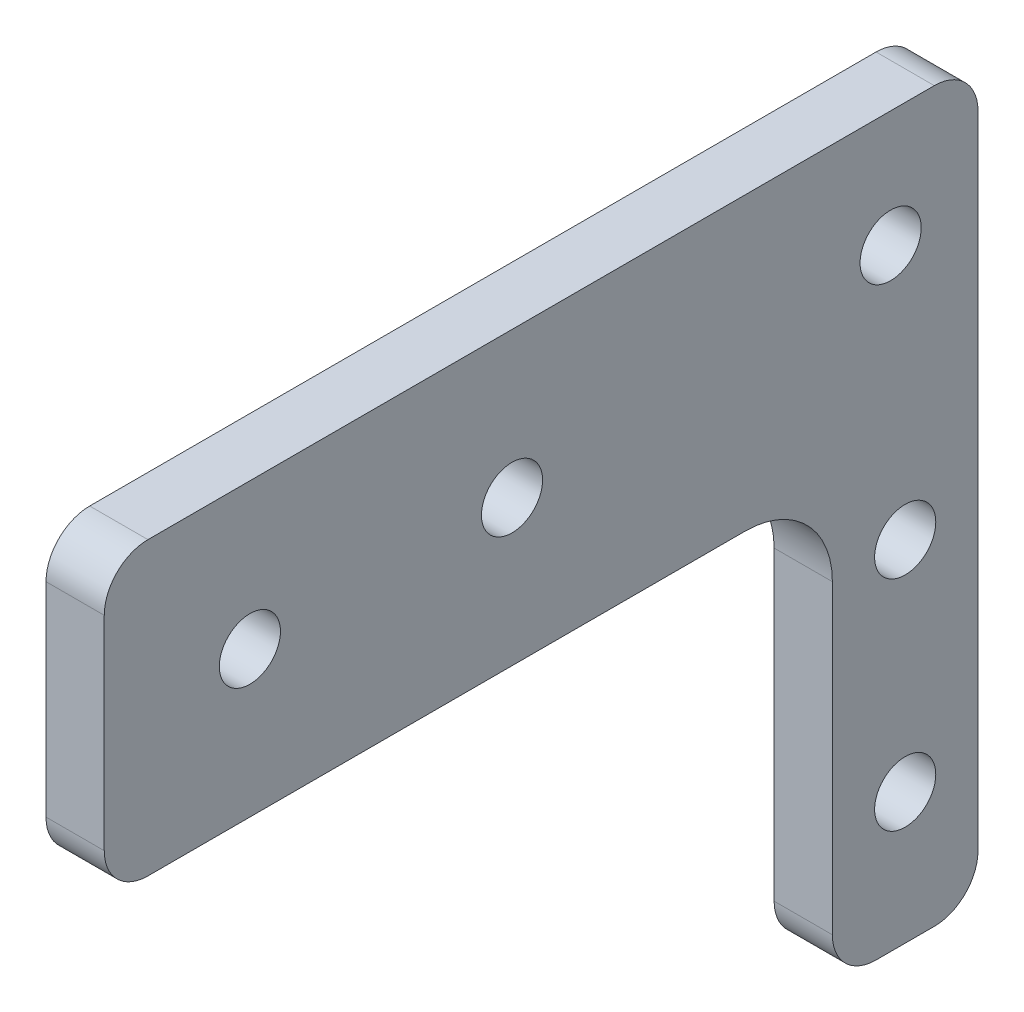
ISO-10303-21;
HEADER;
FILE_DESCRIPTION(('STEP AP214'),'2;1');
FILE_NAME('part.step','',(''),(''),'','','');
FILE_SCHEMA(('AUTOMOTIVE_DESIGN { 1 0 10303 214 1 1 1 1 }'));
ENDSEC;
DATA;
#1=APPLICATION_CONTEXT('core data for automotive mechanical design processes');
#2=APPLICATION_PROTOCOL_DEFINITION('international standard','automotive_design',2000,#1);
#3=PRODUCT_CONTEXT('',#1,'mechanical');
#4=PRODUCT('Part','Part','',(#3));
#5=PRODUCT_RELATED_PRODUCT_CATEGORY('part','',(#4));
#6=PRODUCT_DEFINITION_FORMATION('','',#4);
#7=PRODUCT_DEFINITION_CONTEXT('part definition',#1,'design');
#8=PRODUCT_DEFINITION('design','',#6,#7);
#9=PRODUCT_DEFINITION_SHAPE('','',#8);
#10=(LENGTH_UNIT() NAMED_UNIT(*) SI_UNIT(.MILLI.,.METRE.));
#11=(NAMED_UNIT(*) PLANE_ANGLE_UNIT() SI_UNIT($,.RADIAN.));
#12=(NAMED_UNIT(*) SI_UNIT($,.STERADIAN.) SOLID_ANGLE_UNIT());
#13=UNCERTAINTY_MEASURE_WITH_UNIT(LENGTH_MEASURE(1.E-05),#10,'distance_accuracy_value','');
#14=(GEOMETRIC_REPRESENTATION_CONTEXT(3) GLOBAL_UNCERTAINTY_ASSIGNED_CONTEXT((#13)) GLOBAL_UNIT_ASSIGNED_CONTEXT((#10,
#11,#12)) REPRESENTATION_CONTEXT('',''));
#15=CARTESIAN_POINT('',(0.,0.,0.));
#16=DIRECTION('',(0.,0.,1.));
#17=DIRECTION('',(1.,0.,0.));
#18=AXIS2_PLACEMENT_3D('',#15,#16,#17);
#19=CARTESIAN_POINT('',(4.,54.0416666666667,170.25));
#20=DIRECTION('',(-1.,0.,0.));
#21=DIRECTION('',(0.,0.,1.));
#22=AXIS2_PLACEMENT_3D('',#19,#20,#21);
#23=CYLINDRICAL_SURFACE('',#22,6.00000000000002);
#24=CARTESIAN_POINT('',(0.,54.0416666666667,170.25));
#25=DIRECTION('',(-1.,0.,0.));
#26=DIRECTION('',(0.,0.,-1.));
#27=AXIS2_PLACEMENT_3D('',#24,#25,#26);
#28=CIRCLE('',#27,6.00000000000002);
#29=CARTESIAN_POINT('',(0.,60.0416666666667,170.25));
#30=VERTEX_POINT('',#29);
#31=CARTESIAN_POINT('',(0.,54.0416666666667,164.25));
#32=VERTEX_POINT('',#31);
#33=EDGE_CURVE('E156',#30,#32,#28,.T.);
#34=ORIENTED_EDGE('',*,*,#33,.T.);
#35=DIRECTION('',(-1.,0.,0.));
#36=VECTOR('',#35,1.);
#37=CARTESIAN_POINT('',(4.,54.0416666666667,164.25));
#38=LINE('',#37,#36);
#39=CARTESIAN_POINT('',(4.,54.0416666666667,164.25));
#40=VERTEX_POINT('',#39);
#41=EDGE_CURVE('E11',#40,#32,#38,.T.);
#42=ORIENTED_EDGE('',*,*,#41,.F.);
#43=CARTESIAN_POINT('',(4.,54.0416666666667,170.25));
#44=DIRECTION('',(-1.,0.,0.));
#45=DIRECTION('',(0.,0.,-1.));
#46=AXIS2_PLACEMENT_3D('',#43,#44,#45);
#47=CIRCLE('',#46,6.00000000000002);
#48=CARTESIAN_POINT('',(4.,60.0416666666667,170.25));
#49=VERTEX_POINT('',#48);
#50=EDGE_CURVE('E178',#49,#40,#47,.T.);
#51=ORIENTED_EDGE('',*,*,#50,.F.);
#52=DIRECTION('',(-1.,0.,0.));
#53=VECTOR('',#52,1.);
#54=CARTESIAN_POINT('',(4.,60.0416666666667,170.25));
#55=LINE('',#54,#53);
#56=EDGE_CURVE('E152',#49,#30,#55,.T.);
#57=ORIENTED_EDGE('',*,*,#56,.T.);
#58=EDGE_LOOP('',(#34,#42,#51,#57));
#59=FACE_BOUND('',#58,.T.);
#60=ADVANCED_FACE('F34',(#59),#23,.F.);
#61=CARTESIAN_POINT('',(4.,33.0416666666667,164.25));
#62=DIRECTION('',(0.,0.,-1.));
#63=DIRECTION('',(0.,1.,0.));
#64=AXIS2_PLACEMENT_3D('',#61,#62,#63);
#65=PLANE('',#64);
#66=DIRECTION('',(0.,-1.,0.));
#67=VECTOR('',#66,1.);
#68=CARTESIAN_POINT('',(0.,33.0416666666667,164.25));
#69=LINE('',#68,#67);
#70=CARTESIAN_POINT('',(0.,33.0416666666667,164.25));
#71=VERTEX_POINT('',#70);
#72=EDGE_CURVE('E159',#32,#71,#69,.T.);
#73=ORIENTED_EDGE('',*,*,#72,.T.);
#74=DIRECTION('',(-1.,0.,0.));
#75=VECTOR('',#74,1.);
#76=CARTESIAN_POINT('',(4.,33.0416666666667,164.25));
#77=LINE('',#76,#75);
#78=CARTESIAN_POINT('',(4.,33.0416666666667,164.25));
#79=VERTEX_POINT('',#78);
#80=EDGE_CURVE('E43',#79,#71,#77,.T.);
#81=ORIENTED_EDGE('',*,*,#80,.F.);
#82=DIRECTION('',(0.,-1.,0.));
#83=VECTOR('',#82,1.);
#84=CARTESIAN_POINT('',(4.,33.0416666666667,164.25));
#85=LINE('',#84,#83);
#86=EDGE_CURVE('E107',#40,#79,#85,.T.);
#87=ORIENTED_EDGE('',*,*,#86,.F.);
#88=ORIENTED_EDGE('',*,*,#41,.T.);
#89=EDGE_LOOP('',(#73,#81,#87,#88));
#90=FACE_BOUND('',#89,.T.);
#91=ADVANCED_FACE('F234',(#90),#65,.F.);
#92=CARTESIAN_POINT('',(4.,33.0416666666667,161.25));
#93=DIRECTION('',(-1.,0.,0.));
#94=DIRECTION('',(0.,0.,1.));
#95=AXIS2_PLACEMENT_3D('',#92,#93,#94);
#96=CYLINDRICAL_SURFACE('',#95,3.);
#97=CARTESIAN_POINT('',(0.,33.0416666666667,161.25));
#98=DIRECTION('',(1.,0.,0.));
#99=DIRECTION('',(0.,0.,1.));
#100=AXIS2_PLACEMENT_3D('',#97,#98,#99);
#101=CIRCLE('',#100,3.);
#102=CARTESIAN_POINT('',(0.,30.0416666666667,161.25));
#103=VERTEX_POINT('',#102);
#104=EDGE_CURVE('E161',#71,#103,#101,.T.);
#105=ORIENTED_EDGE('',*,*,#104,.T.);
#106=DIRECTION('',(-1.,0.,0.));
#107=VECTOR('',#106,1.);
#108=CARTESIAN_POINT('',(4.,30.0416666666667,161.25));
#109=LINE('',#108,#107);
#110=CARTESIAN_POINT('',(4.,30.0416666666667,161.25));
#111=VERTEX_POINT('',#110);
#112=EDGE_CURVE('E197',#111,#103,#109,.T.);
#113=ORIENTED_EDGE('',*,*,#112,.F.);
#114=CARTESIAN_POINT('',(4.,33.0416666666667,161.25));
#115=DIRECTION('',(1.,0.,0.));
#116=DIRECTION('',(0.,0.,1.));
#117=AXIS2_PLACEMENT_3D('',#114,#115,#116);
#118=CIRCLE('',#117,3.);
#119=EDGE_CURVE('E249',#79,#111,#118,.T.);
#120=ORIENTED_EDGE('',*,*,#119,.F.);
#121=ORIENTED_EDGE('',*,*,#80,.T.);
#122=EDGE_LOOP('',(#105,#113,#120,#121));
#123=FACE_BOUND('',#122,.T.);
#124=ADVANCED_FACE('F239',(#123),#96,.T.);
#125=CARTESIAN_POINT('',(4.,30.0416666666667,157.25));
#126=DIRECTION('',(0.,1.,0.));
#127=DIRECTION('',(0.,0.,1.));
#128=AXIS2_PLACEMENT_3D('',#125,#126,#127);
#129=PLANE('',#128);
#130=DIRECTION('',(0.,0.,-1.));
#131=VECTOR('',#130,1.);
#132=CARTESIAN_POINT('',(0.,30.0416666666667,157.25));
#133=LINE('',#132,#131);
#134=CARTESIAN_POINT('',(0.,30.0416666666667,157.25));
#135=VERTEX_POINT('',#134);
#136=EDGE_CURVE('E163',#103,#135,#133,.T.);
#137=ORIENTED_EDGE('',*,*,#136,.T.);
#138=DIRECTION('',(-1.,0.,0.));
#139=VECTOR('',#138,1.);
#140=CARTESIAN_POINT('',(4.,30.0416666666667,157.25));
#141=LINE('',#140,#139);
#142=CARTESIAN_POINT('',(4.,30.0416666666667,157.25));
#143=VERTEX_POINT('',#142);
#144=EDGE_CURVE('E194',#143,#135,#141,.T.);
#145=ORIENTED_EDGE('',*,*,#144,.F.);
#146=DIRECTION('',(0.,0.,-1.));
#147=VECTOR('',#146,1.);
#148=CARTESIAN_POINT('',(4.,30.0416666666667,157.25));
#149=LINE('',#148,#147);
#150=EDGE_CURVE('E251',#111,#143,#149,.T.);
#151=ORIENTED_EDGE('',*,*,#150,.F.);
#152=ORIENTED_EDGE('',*,*,#112,.T.);
#153=EDGE_LOOP('',(#137,#145,#151,#152));
#154=FACE_BOUND('',#153,.T.);
#155=ADVANCED_FACE('F289',(#154),#129,.F.);
#156=CARTESIAN_POINT('',(4.,33.0416666666667,157.25));
#157=DIRECTION('',(-1.,0.,0.));
#158=DIRECTION('',(0.,0.,1.));
#159=AXIS2_PLACEMENT_3D('',#156,#157,#158);
#160=CYLINDRICAL_SURFACE('',#159,3.00000000000002);
#161=CARTESIAN_POINT('',(0.,33.0416666666667,157.25));
#162=DIRECTION('',(1.,0.,0.));
#163=DIRECTION('',(0.,0.,-1.));
#164=AXIS2_PLACEMENT_3D('',#161,#162,#163);
#165=CIRCLE('',#164,3.00000000000002);
#166=CARTESIAN_POINT('',(0.,33.0416666666667,154.25));
#167=VERTEX_POINT('',#166);
#168=EDGE_CURVE('E165',#135,#167,#165,.T.);
#169=ORIENTED_EDGE('',*,*,#168,.T.);
#170=DIRECTION('',(-1.,0.,0.));
#171=VECTOR('',#170,1.);
#172=CARTESIAN_POINT('',(4.,33.0416666666667,154.25));
#173=LINE('',#172,#171);
#174=CARTESIAN_POINT('',(4.,33.0416666666667,154.25));
#175=VERTEX_POINT('',#174);
#176=EDGE_CURVE('E191',#175,#167,#173,.T.);
#177=ORIENTED_EDGE('',*,*,#176,.F.);
#178=CARTESIAN_POINT('',(4.,33.0416666666667,157.25));
#179=DIRECTION('',(1.,0.,0.));
#180=DIRECTION('',(0.,0.,-1.));
#181=AXIS2_PLACEMENT_3D('',#178,#179,#180);
#182=CIRCLE('',#181,3.00000000000002);
#183=EDGE_CURVE('E253',#143,#175,#182,.T.);
#184=ORIENTED_EDGE('',*,*,#183,.F.);
#185=ORIENTED_EDGE('',*,*,#144,.T.);
#186=EDGE_LOOP('',(#169,#177,#184,#185));
#187=FACE_BOUND('',#186,.T.);
#188=ADVANCED_FACE('F286',(#187),#160,.T.);
#189=CARTESIAN_POINT('',(4.,77.0416666666667,154.25));
#190=DIRECTION('',(0.,0.,1.));
#191=DIRECTION('',(0.,-1.,0.));
#192=AXIS2_PLACEMENT_3D('',#189,#190,#191);
#193=PLANE('',#192);
#194=DIRECTION('',(0.,1.,0.));
#195=VECTOR('',#194,1.);
#196=CARTESIAN_POINT('',(0.,77.0416666666667,154.25));
#197=LINE('',#196,#195);
#198=CARTESIAN_POINT('',(0.,77.0416666666667,154.25));
#199=VERTEX_POINT('',#198);
#200=EDGE_CURVE('E167',#167,#199,#197,.T.);
#201=ORIENTED_EDGE('',*,*,#200,.T.);
#202=DIRECTION('',(-1.,0.,0.));
#203=VECTOR('',#202,1.);
#204=CARTESIAN_POINT('',(4.,77.0416666666667,154.25));
#205=LINE('',#204,#203);
#206=CARTESIAN_POINT('',(4.,77.0416666666667,154.25));
#207=VERTEX_POINT('',#206);
#208=EDGE_CURVE('E188',#207,#199,#205,.T.);
#209=ORIENTED_EDGE('',*,*,#208,.F.);
#210=DIRECTION('',(0.,1.,0.));
#211=VECTOR('',#210,1.);
#212=CARTESIAN_POINT('',(4.,77.0416666666667,154.25));
#213=LINE('',#212,#211);
#214=EDGE_CURVE('E259',#175,#207,#213,.T.);
#215=ORIENTED_EDGE('',*,*,#214,.F.);
#216=ORIENTED_EDGE('',*,*,#176,.T.);
#217=EDGE_LOOP('',(#201,#209,#215,#216));
#218=FACE_BOUND('',#217,.T.);
#219=ADVANCED_FACE('F282',(#218),#193,.F.);
#220=CARTESIAN_POINT('',(4.,77.0416666666667,157.25));
#221=DIRECTION('',(-1.,0.,0.));
#222=DIRECTION('',(0.,0.,1.));
#223=AXIS2_PLACEMENT_3D('',#220,#221,#222);
#224=CYLINDRICAL_SURFACE('',#223,3.);
#225=CARTESIAN_POINT('',(0.,77.0416666666667,157.25));
#226=DIRECTION('',(1.,0.,0.));
#227=DIRECTION('',(0.,0.,1.));
#228=AXIS2_PLACEMENT_3D('',#225,#226,#227);
#229=CIRCLE('',#228,3.);
#230=CARTESIAN_POINT('',(0.,80.0416666666667,157.25));
#231=VERTEX_POINT('',#230);
#232=EDGE_CURVE('E169',#199,#231,#229,.T.);
#233=ORIENTED_EDGE('',*,*,#232,.T.);
#234=DIRECTION('',(-1.,0.,0.));
#235=VECTOR('',#234,1.);
#236=CARTESIAN_POINT('',(4.,80.0416666666667,157.25));
#237=LINE('',#236,#235);
#238=CARTESIAN_POINT('',(4.,80.0416666666667,157.25));
#239=VERTEX_POINT('',#238);
#240=EDGE_CURVE('E185',#239,#231,#237,.T.);
#241=ORIENTED_EDGE('',*,*,#240,.F.);
#242=CARTESIAN_POINT('',(4.,77.0416666666667,157.25));
#243=DIRECTION('',(1.,0.,0.));
#244=DIRECTION('',(0.,0.,1.));
#245=AXIS2_PLACEMENT_3D('',#242,#243,#244);
#246=CIRCLE('',#245,3.);
#247=EDGE_CURVE('E261',#207,#239,#246,.T.);
#248=ORIENTED_EDGE('',*,*,#247,.F.);
#249=ORIENTED_EDGE('',*,*,#208,.T.);
#250=EDGE_LOOP('',(#233,#241,#248,#249));
#251=FACE_BOUND('',#250,.T.);
#252=ADVANCED_FACE('F278',(#251),#224,.T.);
#253=CARTESIAN_POINT('',(4.,80.0416666666667,211.25));
#254=DIRECTION('',(0.,-1.,0.));
#255=DIRECTION('',(0.,0.,-1.));
#256=AXIS2_PLACEMENT_3D('',#253,#254,#255);
#257=PLANE('',#256);
#258=DIRECTION('',(0.,0.,1.));
#259=VECTOR('',#258,1.);
#260=CARTESIAN_POINT('',(0.,80.0416666666667,211.25));
#261=LINE('',#260,#259);
#262=CARTESIAN_POINT('',(0.,80.0416666666667,211.25));
#263=VERTEX_POINT('',#262);
#264=EDGE_CURVE('E171',#231,#263,#261,.T.);
#265=ORIENTED_EDGE('',*,*,#264,.T.);
#266=DIRECTION('',(-1.,0.,0.));
#267=VECTOR('',#266,1.);
#268=CARTESIAN_POINT('',(4.,80.0416666666667,211.25));
#269=LINE('',#268,#267);
#270=CARTESIAN_POINT('',(4.,80.0416666666667,211.25));
#271=VERTEX_POINT('',#270);
#272=EDGE_CURVE('E182',#271,#263,#269,.T.);
#273=ORIENTED_EDGE('',*,*,#272,.F.);
#274=DIRECTION('',(0.,0.,1.));
#275=VECTOR('',#274,1.);
#276=CARTESIAN_POINT('',(4.,80.0416666666667,211.25));
#277=LINE('',#276,#275);
#278=EDGE_CURVE('E263',#239,#271,#277,.T.);
#279=ORIENTED_EDGE('',*,*,#278,.F.);
#280=ORIENTED_EDGE('',*,*,#240,.T.);
#281=EDGE_LOOP('',(#265,#273,#279,#280));
#282=FACE_BOUND('',#281,.T.);
#283=ADVANCED_FACE('F269',(#282),#257,.F.);
#284=CARTESIAN_POINT('',(4.,77.0416666666667,211.25));
#285=DIRECTION('',(-1.,0.,0.));
#286=DIRECTION('',(0.,0.,1.));
#287=AXIS2_PLACEMENT_3D('',#284,#285,#286);
#288=CYLINDRICAL_SURFACE('',#287,3.);
#289=CARTESIAN_POINT('',(0.,77.0416666666667,211.25));
#290=DIRECTION('',(1.,0.,0.));
#291=DIRECTION('',(0.,0.,1.));
#292=AXIS2_PLACEMENT_3D('',#289,#290,#291);
#293=CIRCLE('',#292,3.);
#294=CARTESIAN_POINT('',(0.,77.0416666666667,214.25));
#295=VERTEX_POINT('',#294);
#296=EDGE_CURVE('E173',#263,#295,#293,.T.);
#297=ORIENTED_EDGE('',*,*,#296,.T.);
#298=DIRECTION('',(-1.,0.,0.));
#299=VECTOR('',#298,1.);
#300=CARTESIAN_POINT('',(4.,77.0416666666667,214.25));
#301=LINE('',#300,#299);
#302=CARTESIAN_POINT('',(4.,77.0416666666667,214.25));
#303=VERTEX_POINT('',#302);
#304=EDGE_CURVE('E147',#303,#295,#301,.T.);
#305=ORIENTED_EDGE('',*,*,#304,.F.);
#306=CARTESIAN_POINT('',(4.,77.0416666666667,211.25));
#307=DIRECTION('',(1.,0.,0.));
#308=DIRECTION('',(0.,0.,1.));
#309=AXIS2_PLACEMENT_3D('',#306,#307,#308);
#310=CIRCLE('',#309,3.);
#311=EDGE_CURVE('E138',#271,#303,#310,.T.);
#312=ORIENTED_EDGE('',*,*,#311,.F.);
#313=ORIENTED_EDGE('',*,*,#272,.T.);
#314=EDGE_LOOP('',(#297,#305,#312,#313));
#315=FACE_BOUND('',#314,.T.);
#316=ADVANCED_FACE('F273',(#315),#288,.T.);
#317=CARTESIAN_POINT('',(4.,63.0416666666667,214.25));
#318=DIRECTION('',(0.,0.,-1.));
#319=DIRECTION('',(-1.,0.,0.));
#320=AXIS2_PLACEMENT_3D('',#317,#318,#319);
#321=PLANE('',#320);
#322=DIRECTION('',(0.,-1.,0.));
#323=VECTOR('',#322,1.);
#324=CARTESIAN_POINT('',(0.,63.0416666666667,214.25));
#325=LINE('',#324,#323);
#326=CARTESIAN_POINT('',(0.,63.0416666666667,214.25));
#327=VERTEX_POINT('',#326);
#328=EDGE_CURVE('E146',#295,#327,#325,.T.);
#329=ORIENTED_EDGE('',*,*,#328,.T.);
#330=DIRECTION('',(-1.,0.,0.));
#331=VECTOR('',#330,1.);
#332=CARTESIAN_POINT('',(4.,63.0416666666667,214.25));
#333=LINE('',#332,#331);
#334=CARTESIAN_POINT('',(4.,63.0416666666667,214.25));
#335=VERTEX_POINT('',#334);
#336=EDGE_CURVE('E143',#335,#327,#333,.T.);
#337=ORIENTED_EDGE('',*,*,#336,.F.);
#338=DIRECTION('',(0.,-1.,0.));
#339=VECTOR('',#338,1.);
#340=CARTESIAN_POINT('',(4.,63.0416666666667,214.25));
#341=LINE('',#340,#339);
#342=EDGE_CURVE('E132',#303,#335,#341,.T.);
#343=ORIENTED_EDGE('',*,*,#342,.F.);
#344=ORIENTED_EDGE('',*,*,#304,.T.);
#345=EDGE_LOOP('',(#329,#337,#343,#344));
#346=FACE_BOUND('',#345,.T.);
#347=ADVANCED_FACE('F144',(#346),#321,.F.);
#348=CARTESIAN_POINT('',(4.,63.0416666666667,211.25));
#349=DIRECTION('',(-1.,0.,0.));
#350=DIRECTION('',(0.,0.,1.));
#351=AXIS2_PLACEMENT_3D('',#348,#349,#350);
#352=CYLINDRICAL_SURFACE('',#351,3.);
#353=CARTESIAN_POINT('',(0.,63.0416666666667,211.25));
#354=DIRECTION('',(1.,0.,0.));
#355=DIRECTION('',(0.,0.,-1.));
#356=AXIS2_PLACEMENT_3D('',#353,#354,#355);
#357=CIRCLE('',#356,3.);
#358=CARTESIAN_POINT('',(0.,60.0416666666667,211.25));
#359=VERTEX_POINT('',#358);
#360=EDGE_CURVE('E93',#327,#359,#357,.T.);
#361=ORIENTED_EDGE('',*,*,#360,.T.);
#362=DIRECTION('',(-1.,0.,0.));
#363=VECTOR('',#362,1.);
#364=CARTESIAN_POINT('',(4.,60.0416666666667,211.25));
#365=LINE('',#364,#363);
#366=CARTESIAN_POINT('',(4.,60.0416666666667,211.25));
#367=VERTEX_POINT('',#366);
#368=EDGE_CURVE('E148',#367,#359,#365,.T.);
#369=ORIENTED_EDGE('',*,*,#368,.F.);
#370=CARTESIAN_POINT('',(4.,63.0416666666667,211.25));
#371=DIRECTION('',(1.,0.,0.));
#372=DIRECTION('',(0.,0.,-1.));
#373=AXIS2_PLACEMENT_3D('',#370,#371,#372);
#374=CIRCLE('',#373,3.);
#375=EDGE_CURVE('E136',#335,#367,#374,.T.);
#376=ORIENTED_EDGE('',*,*,#375,.F.);
#377=ORIENTED_EDGE('',*,*,#336,.T.);
#378=EDGE_LOOP('',(#361,#369,#376,#377));
#379=FACE_BOUND('',#378,.T.);
#380=ADVANCED_FACE('F150',(#379),#352,.T.);
#381=CARTESIAN_POINT('',(4.,60.0416666666667,170.25));
#382=DIRECTION('',(0.,1.,0.));
#383=DIRECTION('',(0.,0.,1.));
#384=AXIS2_PLACEMENT_3D('',#381,#382,#383);
#385=PLANE('',#384);
#386=DIRECTION('',(0.,0.,-1.));
#387=VECTOR('',#386,1.);
#388=CARTESIAN_POINT('',(0.,60.0416666666667,170.25));
#389=LINE('',#388,#387);
#390=EDGE_CURVE('E99',#359,#30,#389,.T.);
#391=ORIENTED_EDGE('',*,*,#390,.T.);
#392=ORIENTED_EDGE('',*,*,#56,.F.);
#393=DIRECTION('',(0.,0.,-1.));
#394=VECTOR('',#393,1.);
#395=CARTESIAN_POINT('',(4.,60.0416666666667,170.25));
#396=LINE('',#395,#394);
#397=EDGE_CURVE('E52',#367,#49,#396,.T.);
#398=ORIENTED_EDGE('',*,*,#397,.F.);
#399=ORIENTED_EDGE('',*,*,#368,.T.);
#400=EDGE_LOOP('',(#391,#392,#398,#399));
#401=FACE_BOUND('',#400,.T.);
#402=ADVANCED_FACE('F311',(#401),#385,.F.);
#403=CARTESIAN_POINT('',(4.,54.0416666666667,170.25));
#404=DIRECTION('',(1.,0.,0.));
#405=DIRECTION('',(0.,0.,-1.));
#406=AXIS2_PLACEMENT_3D('',#403,#404,#405);
#407=PLANE('',#406);
#408=CARTESIAN_POINT('',(4.,70.0416666666667,204.25));
#409=DIRECTION('',(1.,0.,0.));
#410=DIRECTION('',(0.,0.,-1.));
#411=AXIS2_PLACEMENT_3D('',#408,#409,#410);
#412=CIRCLE('',#411,2.09999999999999);
#413=CARTESIAN_POINT('',(4.,70.0416666666667,202.15));
#414=VERTEX_POINT('',#413);
#415=EDGE_CURVE('E206',#414,#414,#412,.T.);
#416=ORIENTED_EDGE('',*,*,#415,.F.);
#417=EDGE_LOOP('',(#416));
#418=FACE_BOUND('',#417,.T.);
#419=CARTESIAN_POINT('',(4.,39.0416666666667,159.25));
#420=DIRECTION('',(1.,0.,0.));
#421=DIRECTION('',(0.,0.,-1.));
#422=AXIS2_PLACEMENT_3D('',#419,#420,#421);
#423=CIRCLE('',#422,2.09999999999999);
#424=CARTESIAN_POINT('',(4.,39.0416666666667,157.15));
#425=VERTEX_POINT('',#424);
#426=EDGE_CURVE('E344',#425,#425,#423,.T.);
#427=ORIENTED_EDGE('',*,*,#426,.F.);
#428=EDGE_LOOP('',(#427));
#429=FACE_BOUND('',#428,.T.);
#430=CARTESIAN_POINT('',(4.,72.0416666666667,160.25));
#431=DIRECTION('',(1.,0.,0.));
#432=DIRECTION('',(0.,0.,-1.));
#433=AXIS2_PLACEMENT_3D('',#430,#431,#432);
#434=CIRCLE('',#433,2.09999999999999);
#435=CARTESIAN_POINT('',(4.,72.0416666666667,158.15));
#436=VERTEX_POINT('',#435);
#437=EDGE_CURVE('E333',#436,#436,#434,.T.);
#438=ORIENTED_EDGE('',*,*,#437,.F.);
#439=EDGE_LOOP('',(#438));
#440=FACE_BOUND('',#439,.T.);
#441=CARTESIAN_POINT('',(4.,54.0416666666667,159.25));
#442=DIRECTION('',(1.,0.,0.));
#443=DIRECTION('',(0.,0.,-1.));
#444=AXIS2_PLACEMENT_3D('',#441,#442,#443);
#445=CIRCLE('',#444,2.09999999999999);
#446=CARTESIAN_POINT('',(4.,54.0416666666667,157.15));
#447=VERTEX_POINT('',#446);
#448=EDGE_CURVE('E343',#447,#447,#445,.T.);
#449=ORIENTED_EDGE('',*,*,#448,.F.);
#450=EDGE_LOOP('',(#449));
#451=FACE_BOUND('',#450,.T.);
#452=CARTESIAN_POINT('',(4.,70.0416666666667,186.25));
#453=DIRECTION('',(1.,0.,0.));
#454=DIRECTION('',(0.,0.,-1.));
#455=AXIS2_PLACEMENT_3D('',#452,#453,#454);
#456=CIRCLE('',#455,2.09999999999999);
#457=CARTESIAN_POINT('',(4.,70.0416666666667,184.15));
#458=VERTEX_POINT('',#457);
#459=EDGE_CURVE('E347',#458,#458,#456,.T.);
#460=ORIENTED_EDGE('',*,*,#459,.F.);
#461=EDGE_LOOP('',(#460));
#462=FACE_BOUND('',#461,.T.);
#463=ORIENTED_EDGE('',*,*,#50,.T.);
#464=ORIENTED_EDGE('',*,*,#86,.T.);
#465=ORIENTED_EDGE('',*,*,#119,.T.);
#466=ORIENTED_EDGE('',*,*,#150,.T.);
#467=ORIENTED_EDGE('',*,*,#183,.T.);
#468=ORIENTED_EDGE('',*,*,#214,.T.);
#469=ORIENTED_EDGE('',*,*,#247,.T.);
#470=ORIENTED_EDGE('',*,*,#278,.T.);
#471=ORIENTED_EDGE('',*,*,#311,.T.);
#472=ORIENTED_EDGE('',*,*,#342,.T.);
#473=ORIENTED_EDGE('',*,*,#375,.T.);
#474=ORIENTED_EDGE('',*,*,#397,.T.);
#475=EDGE_LOOP('',(#463,#464,#465,#466,#467,#468,#469,#470,#471,#472,#473,#474));
#476=FACE_BOUND('',#475,.T.);
#477=ADVANCED_FACE('F134',(#418,#429,#440,#451,#462,#476),#407,.T.);
#478=CARTESIAN_POINT('',(0.,54.0416666666667,170.25));
#479=DIRECTION('',(1.,0.,0.));
#480=DIRECTION('',(0.,0.,-1.));
#481=AXIS2_PLACEMENT_3D('',#478,#479,#480);
#482=PLANE('',#481);
#483=CARTESIAN_POINT('',(0.,70.0416666666667,204.25));
#484=DIRECTION('',(1.,0.,0.));
#485=DIRECTION('',(0.,0.,-1.));
#486=AXIS2_PLACEMENT_3D('',#483,#484,#485);
#487=CIRCLE('',#486,2.09999999999999);
#488=CARTESIAN_POINT('',(0.,70.0416666666667,202.15));
#489=VERTEX_POINT('',#488);
#490=EDGE_CURVE('E37',#489,#489,#487,.T.);
#491=ORIENTED_EDGE('',*,*,#490,.T.);
#492=EDGE_LOOP('',(#491));
#493=FACE_BOUND('',#492,.T.);
#494=CARTESIAN_POINT('',(0.,39.0416666666667,159.25));
#495=DIRECTION('',(1.,0.,0.));
#496=DIRECTION('',(0.,0.,-1.));
#497=AXIS2_PLACEMENT_3D('',#494,#495,#496);
#498=CIRCLE('',#497,2.09999999999999);
#499=CARTESIAN_POINT('',(0.,39.0416666666667,157.15));
#500=VERTEX_POINT('',#499);
#501=EDGE_CURVE('E211',#500,#500,#498,.T.);
#502=ORIENTED_EDGE('',*,*,#501,.T.);
#503=EDGE_LOOP('',(#502));
#504=FACE_BOUND('',#503,.T.);
#505=CARTESIAN_POINT('',(0.,72.0416666666667,160.25));
#506=DIRECTION('',(1.,0.,0.));
#507=DIRECTION('',(0.,0.,-1.));
#508=AXIS2_PLACEMENT_3D('',#505,#506,#507);
#509=CIRCLE('',#508,2.09999999999999);
#510=CARTESIAN_POINT('',(0.,72.0416666666667,158.15));
#511=VERTEX_POINT('',#510);
#512=EDGE_CURVE('E209',#511,#511,#509,.T.);
#513=ORIENTED_EDGE('',*,*,#512,.T.);
#514=EDGE_LOOP('',(#513));
#515=FACE_BOUND('',#514,.T.);
#516=CARTESIAN_POINT('',(0.,54.0416666666667,159.25));
#517=DIRECTION('',(1.,0.,0.));
#518=DIRECTION('',(0.,0.,-1.));
#519=AXIS2_PLACEMENT_3D('',#516,#517,#518);
#520=CIRCLE('',#519,2.09999999999999);
#521=CARTESIAN_POINT('',(0.,54.0416666666667,157.15));
#522=VERTEX_POINT('',#521);
#523=EDGE_CURVE('E205',#522,#522,#520,.T.);
#524=ORIENTED_EDGE('',*,*,#523,.T.);
#525=EDGE_LOOP('',(#524));
#526=FACE_BOUND('',#525,.T.);
#527=CARTESIAN_POINT('',(0.,70.0416666666667,186.25));
#528=DIRECTION('',(1.,0.,0.));
#529=DIRECTION('',(0.,0.,-1.));
#530=AXIS2_PLACEMENT_3D('',#527,#528,#529);
#531=CIRCLE('',#530,2.09999999999999);
#532=CARTESIAN_POINT('',(0.,70.0416666666667,184.15));
#533=VERTEX_POINT('',#532);
#534=EDGE_CURVE('E202',#533,#533,#531,.T.);
#535=ORIENTED_EDGE('',*,*,#534,.T.);
#536=EDGE_LOOP('',(#535));
#537=FACE_BOUND('',#536,.T.);
#538=ORIENTED_EDGE('',*,*,#33,.F.);
#539=ORIENTED_EDGE('',*,*,#390,.F.);
#540=ORIENTED_EDGE('',*,*,#360,.F.);
#541=ORIENTED_EDGE('',*,*,#328,.F.);
#542=ORIENTED_EDGE('',*,*,#296,.F.);
#543=ORIENTED_EDGE('',*,*,#264,.F.);
#544=ORIENTED_EDGE('',*,*,#232,.F.);
#545=ORIENTED_EDGE('',*,*,#200,.F.);
#546=ORIENTED_EDGE('',*,*,#168,.F.);
#547=ORIENTED_EDGE('',*,*,#136,.F.);
#548=ORIENTED_EDGE('',*,*,#104,.F.);
#549=ORIENTED_EDGE('',*,*,#72,.F.);
#550=EDGE_LOOP('',(#538,#539,#540,#541,#542,#543,#544,#545,#546,#547,#548,#549));
#551=FACE_BOUND('',#550,.T.);
#552=ADVANCED_FACE('F218',(#493,#504,#515,#526,#537,#551),#482,.F.);
#553=CARTESIAN_POINT('',(-6.,70.0416666666667,186.25));
#554=DIRECTION('',(1.,0.,0.));
#555=DIRECTION('',(0.,0.,-1.));
#556=AXIS2_PLACEMENT_3D('',#553,#554,#555);
#557=CYLINDRICAL_SURFACE('',#556,2.09999999999999);
#558=ORIENTED_EDGE('',*,*,#459,.T.);
#559=EDGE_LOOP('',(#558));
#560=FACE_BOUND('',#559,.T.);
#561=ORIENTED_EDGE('',*,*,#534,.F.);
#562=EDGE_LOOP('',(#561));
#563=FACE_BOUND('',#562,.T.);
#564=ADVANCED_FACE('F316',(#560,#563),#557,.F.);
#565=CARTESIAN_POINT('',(-6.,54.0416666666667,159.25));
#566=DIRECTION('',(1.,0.,0.));
#567=DIRECTION('',(0.,0.,-1.));
#568=AXIS2_PLACEMENT_3D('',#565,#566,#567);
#569=CYLINDRICAL_SURFACE('',#568,2.09999999999999);
#570=ORIENTED_EDGE('',*,*,#448,.T.);
#571=EDGE_LOOP('',(#570));
#572=FACE_BOUND('',#571,.T.);
#573=ORIENTED_EDGE('',*,*,#523,.F.);
#574=EDGE_LOOP('',(#573));
#575=FACE_BOUND('',#574,.T.);
#576=ADVANCED_FACE('F320',(#572,#575),#569,.F.);
#577=CARTESIAN_POINT('',(-6.,72.0416666666667,160.25));
#578=DIRECTION('',(1.,0.,0.));
#579=DIRECTION('',(0.,0.,-1.));
#580=AXIS2_PLACEMENT_3D('',#577,#578,#579);
#581=CYLINDRICAL_SURFACE('',#580,2.09999999999999);
#582=ORIENTED_EDGE('',*,*,#437,.T.);
#583=EDGE_LOOP('',(#582));
#584=FACE_BOUND('',#583,.T.);
#585=ORIENTED_EDGE('',*,*,#512,.F.);
#586=EDGE_LOOP('',(#585));
#587=FACE_BOUND('',#586,.T.);
#588=ADVANCED_FACE('F228',(#584,#587),#581,.F.);
#589=CARTESIAN_POINT('',(-6.,39.0416666666667,159.25));
#590=DIRECTION('',(1.,0.,0.));
#591=DIRECTION('',(0.,0.,-1.));
#592=AXIS2_PLACEMENT_3D('',#589,#590,#591);
#593=CYLINDRICAL_SURFACE('',#592,2.09999999999999);
#594=ORIENTED_EDGE('',*,*,#426,.T.);
#595=EDGE_LOOP('',(#594));
#596=FACE_BOUND('',#595,.T.);
#597=ORIENTED_EDGE('',*,*,#501,.F.);
#598=EDGE_LOOP('',(#597));
#599=FACE_BOUND('',#598,.T.);
#600=ADVANCED_FACE('F222',(#596,#599),#593,.F.);
#601=CARTESIAN_POINT('',(-6.,70.0416666666667,204.25));
#602=DIRECTION('',(1.,0.,0.));
#603=DIRECTION('',(0.,0.,-1.));
#604=AXIS2_PLACEMENT_3D('',#601,#602,#603);
#605=CYLINDRICAL_SURFACE('',#604,2.09999999999999);
#606=ORIENTED_EDGE('',*,*,#415,.T.);
#607=EDGE_LOOP('',(#606));
#608=FACE_BOUND('',#607,.T.);
#609=ORIENTED_EDGE('',*,*,#490,.F.);
#610=EDGE_LOOP('',(#609));
#611=FACE_BOUND('',#610,.T.);
#612=ADVANCED_FACE('F220',(#608,#611),#605,.F.);
#613=CLOSED_SHELL('',(#60,#91,#124,#155,#188,#219,#252,#283,#316,#347,#380,#402,#477,#552,#564,
#576,#588,#600,#612));
#614=MANIFOLD_SOLID_BREP('B2',#613);
#615=ADVANCED_BREP_SHAPE_REPRESENTATION('',(#18,#614),#14);
#616=SHAPE_DEFINITION_REPRESENTATION(#9,#615);
ENDSEC;
END-ISO-10303-21;
